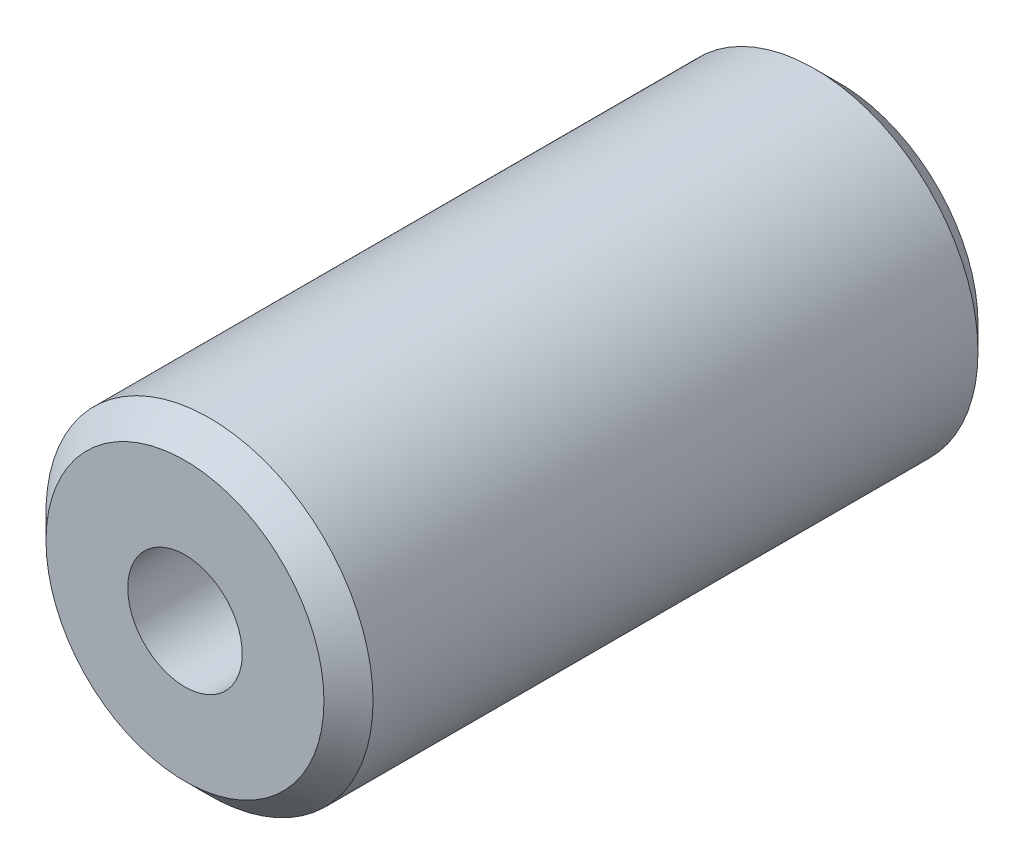
ISO-10303-21;
HEADER;
FILE_DESCRIPTION(('STEP AP214'),'2;1');
FILE_NAME('part.step','',(''),(''),'','','');
FILE_SCHEMA(('AUTOMOTIVE_DESIGN { 1 0 10303 214 1 1 1 1 }'));
ENDSEC;
DATA;
#1=APPLICATION_CONTEXT('core data for automotive mechanical design processes');
#2=APPLICATION_PROTOCOL_DEFINITION('international standard','automotive_design',2000,#1);
#3=PRODUCT_CONTEXT('',#1,'mechanical');
#4=PRODUCT('Part','Part','',(#3));
#5=PRODUCT_RELATED_PRODUCT_CATEGORY('part','',(#4));
#6=PRODUCT_DEFINITION_FORMATION('','',#4);
#7=PRODUCT_DEFINITION_CONTEXT('part definition',#1,'design');
#8=PRODUCT_DEFINITION('design','',#6,#7);
#9=PRODUCT_DEFINITION_SHAPE('','',#8);
#10=(LENGTH_UNIT() NAMED_UNIT(*) SI_UNIT(.MILLI.,.METRE.));
#11=(NAMED_UNIT(*) PLANE_ANGLE_UNIT() SI_UNIT($,.RADIAN.));
#12=(NAMED_UNIT(*) SI_UNIT($,.STERADIAN.) SOLID_ANGLE_UNIT());
#13=UNCERTAINTY_MEASURE_WITH_UNIT(LENGTH_MEASURE(1.E-05),#10,'distance_accuracy_value','');
#14=(GEOMETRIC_REPRESENTATION_CONTEXT(3) GLOBAL_UNCERTAINTY_ASSIGNED_CONTEXT((#13)) GLOBAL_UNIT_ASSIGNED_CONTEXT((#10,
#11,#12)) REPRESENTATION_CONTEXT('',''));
#15=CARTESIAN_POINT('',(0.,0.,0.));
#16=DIRECTION('',(0.,0.,1.));
#17=DIRECTION('',(1.,0.,0.));
#18=AXIS2_PLACEMENT_3D('',#15,#16,#17);
#19=CARTESIAN_POINT('',(0.,0.,40.));
#20=DIRECTION('',(0.,0.,-1.));
#21=DIRECTION('',(-1.,0.,0.));
#22=AXIS2_PLACEMENT_3D('',#19,#20,#21);
#23=CYLINDRICAL_SURFACE('',#22,3.5);
#24=CARTESIAN_POINT('',(0.,-3.5,32.5));
#25=CARTESIAN_POINT('',(0.123728813191223,-3.50000063992499,32.5000004827054));
#26=CARTESIAN_POINT('',(0.247452607509519,-3.4933837716556,32.4907620868087));
#27=CARTESIAN_POINT('',(0.490897056966881,-3.46756729775865,32.4544214069871));
#28=CARTESIAN_POINT('',(0.61061594651881,-3.44836221741437,32.4273113505009));
#29=CARTESIAN_POINT('',(0.842134278979704,-3.39922983630841,32.3569876549631));
#30=CARTESIAN_POINT('',(0.953970069083476,-3.3693562097146,32.3138545858561));
#31=CARTESIAN_POINT('',(1.16823399696302,-3.30119473506673,32.2134238357578));
#32=CARTESIAN_POINT('',(1.27066087203771,-3.26290575998324,32.1561242573817));
#33=CARTESIAN_POINT('',(1.4735973979734,-3.17674762370411,32.0234877338018));
#34=CARTESIAN_POINT('',(1.57311214719791,-3.12832735809472,31.9469943369874));
#35=CARTESIAN_POINT('',(1.75878471370039,-3.02784542835155,31.7810699558849));
#36=CARTESIAN_POINT('',(1.84492211922789,-2.97577837204529,31.6916195954786));
#37=CARTESIAN_POINT('',(2.01766896264091,-2.86208795270916,31.4834268963894));
#38=CARTESIAN_POINT('',(2.10145177248818,-2.80046815480895,31.362322942251));
#39=CARTESIAN_POINT('',(2.24759789691731,-2.68458125505734,31.1046118304847));
#40=CARTESIAN_POINT('',(2.30999535105659,-2.63030251861165,30.9680298502545));
#41=CARTESIAN_POINT('',(2.39420227525009,-2.55341938550326,30.7269408056995));
#42=CARTESIAN_POINT('',(2.42261104159712,-2.52624076170168,30.6262164997981));
#43=CARTESIAN_POINT('',(2.46675383593694,-2.48316150088381,30.4197812335764));
#44=CARTESIAN_POINT('',(2.48251474443333,-2.46723695421588,30.3140813570687));
#45=CARTESIAN_POINT('',(2.50034254973894,-2.44917774353951,30.0996013639044));
#46=CARTESIAN_POINT('',(2.5023204979036,-2.44713265311551,29.9908057812075));
#47=CARTESIAN_POINT('',(2.49216996728832,-2.45746365754183,29.7745348292322));
#48=CARTESIAN_POINT('',(2.48002983581059,-2.46985166511363,29.6670606246193));
#49=CARTESIAN_POINT('',(2.44019893993843,-2.50924006406179,29.4432542762594));
#50=CARTESIAN_POINT('',(2.41071787181293,-2.53790670458072,29.3275472658239));
#51=CARTESIAN_POINT('',(2.33698623060058,-2.60595426548788,29.1042352710489));
#52=CARTESIAN_POINT('',(2.29270292673419,-2.64535889377606,28.9966488951225));
#53=CARTESIAN_POINT('',(2.17519571376577,-2.7433598025775,28.7585440006148));
#54=CARTESIAN_POINT('',(2.09725595934503,-2.80411912140021,28.6312521342945));
#55=CARTESIAN_POINT('',(1.92080796250096,-2.92782316656875,28.3929853846134));
#56=CARTESIAN_POINT('',(1.82227950288261,-2.99076998991497,28.2820267236453));
#57=CARTESIAN_POINT('',(1.60466805722389,-3.11300197414729,28.0770898290715));
#58=CARTESIAN_POINT('',(1.48539228396117,-3.17224499078237,27.9832894993579));
#59=CARTESIAN_POINT('',(1.22853771239818,-3.28024169483456,27.8173552555095));
#60=CARTESIAN_POINT('',(1.09100185946155,-3.32901931213849,27.7451717599272));
#61=CARTESIAN_POINT('',(0.837977937487226,-3.40005921099989,27.6417348098091));
#62=CARTESIAN_POINT('',(0.725838222288053,-3.42591205063844,27.6047356194994));
#63=CARTESIAN_POINT('',(0.495579346511703,-3.46670277833946,27.5467451044777));
#64=CARTESIAN_POINT('',(0.377464597804283,-3.48164859772487,27.5257421472034));
#65=CARTESIAN_POINT('',(0.138134688429566,-3.49933682658195,27.5009131533462));
#66=CARTESIAN_POINT('',(0.016910909629529,-3.50204052258512,27.4971416076008));
#67=CARTESIAN_POINT('',(-0.224436907512662,-3.49488258408794,27.5071669527199));
#68=CARTESIAN_POINT('',(-0.344560827664071,-3.48501961477188,27.5209657098801));
#69=CARTESIAN_POINT('',(-0.574421637419463,-3.45439685890596,27.5642095730714));
#70=CARTESIAN_POINT('',(-0.684380739703779,-3.43417853507596,27.5928780362171));
#71=CARTESIAN_POINT('',(-0.897567876620155,-3.38472449846574,27.6639754785557));
#72=CARTESIAN_POINT('',(-1.00079454106229,-3.35548695698345,27.7064072484338));
#73=CARTESIAN_POINT('',(-1.20788320476993,-3.28693977419553,27.807854882314));
#74=CARTESIAN_POINT('',(-1.31095115376589,-3.2469564625953,27.8680270766985));
#75=CARTESIAN_POINT('',(-1.5059594414495,-3.16124256132459,28.0009906273235));
#76=CARTESIAN_POINT('',(-1.59789105848436,-3.11550752347251,28.073791767055));
#77=CARTESIAN_POINT('',(-1.78551589650356,-3.01253197752163,28.2447675416651));
#78=CARTESIAN_POINT('',(-1.87887834330756,-2.95470727969556,28.3451497459149));
#79=CARTESIAN_POINT('',(-2.04830105316355,-2.83988174609795,28.5601350812065));
#80=CARTESIAN_POINT('',(-2.12435208766381,-2.78288136485279,28.6747457472345));
#81=CARTESIAN_POINT('',(-2.2473442646411,-2.68415113950394,28.8985828988252));
#82=CARTESIAN_POINT('',(-2.29697109549401,-2.64142413683914,29.0058861450973));
#83=CARTESIAN_POINT('',(-2.38125378942134,-2.56570672982984,29.2294007982584));
#84=CARTESIAN_POINT('',(-2.41594132264732,-2.5326957757556,29.3455927394091));
#85=CARTESIAN_POINT('',(-2.4634705571157,-2.48640569092986,29.5626821440547));
#86=CARTESIAN_POINT('',(-2.47917783706206,-2.47059656839565,29.6623973933937));
#87=CARTESIAN_POINT('',(-2.49835466240567,-2.45120901302806,29.8641363726842));
#88=CARTESIAN_POINT('',(-2.50183784984414,-2.44761694614491,29.9661574012901));
#89=CARTESIAN_POINT('',(-2.49632174120909,-2.45324019333315,30.1694917900495));
#90=CARTESIAN_POINT('',(-2.48732159992832,-2.46245637461116,30.270805101819));
#91=CARTESIAN_POINT('',(-2.45749256006836,-2.49221948479094,30.4700140533569));
#92=CARTESIAN_POINT('',(-2.43664536213886,-2.51278394118372,30.5679041566293));
#93=CARTESIAN_POINT('',(-2.37535009925765,-2.570997906227,30.7907070775182));
#94=CARTESIAN_POINT('',(-2.33065409759394,-2.61207539816555,30.9135379866369));
#95=CARTESIAN_POINT('',(-2.22450059032411,-2.70305072969477,31.1481520926754));
#96=CARTESIAN_POINT('',(-2.16301522249272,-2.75296318217848,31.2599165006866));
#97=CARTESIAN_POINT('',(-2.02292450312534,-2.85755496874116,31.4746618909581));
#98=CARTESIAN_POINT('',(-1.94390312666551,-2.9123264130957,31.5773257372321));
#99=CARTESIAN_POINT('',(-1.77067968083222,-3.02079035562719,31.7695944266245));
#100=CARTESIAN_POINT('',(-1.67647239517769,-3.07448247590878,31.8591947622818));
#101=CARTESIAN_POINT('',(-1.45596509730888,-3.1855646755345,32.0380239526068));
#102=CARTESIAN_POINT('',(-1.3269319780441,-3.24201372320469,32.1245621516587));
#103=CARTESIAN_POINT('',(-1.12028117539186,-3.31667944446703,32.2363165140429));
#104=CARTESIAN_POINT('',(-1.04921986546208,-3.33989867907087,32.2705572571761));
#105=CARTESIAN_POINT('',(-0.903173022827915,-3.38231539157859,32.3325028129925));
#106=CARTESIAN_POINT('',(-0.82818902614882,-3.40151442917424,32.3602101609261));
#107=CARTESIAN_POINT('',(-0.631868635659961,-3.44466177853936,32.4220729761585));
#108=CARTESIAN_POINT('',(-0.508104933005473,-3.46524216632152,32.4511405355378));
#109=CARTESIAN_POINT('',(-0.256222780653935,-3.49290436679927,32.4900944489021));
#110=CARTESIAN_POINT('',(-0.128108700082427,-3.49999933742225,32.4999995002073));
#111=CARTESIAN_POINT('',(0.,-3.5,32.5));
#112=B_SPLINE_CURVE_WITH_KNOTS('',3,(#24,#25,#26,#27,#28,#29,#30,#31,#32,#33,#34,#35,#36,#37,
#38,#39,#40,#41,#42,#43,#44,#45,#46,#47,#48,#49,#50,#51,#52,#53,#54,#55,#56,#57,#58,#59,#60,#61,
#62,#63,#64,#65,#66,#67,#68,#69,#70,#71,#72,#73,#74,#75,#76,#77,#78,#79,#80,#81,#82,#83,#84,#85,
#86,#87,#88,#89,#90,#91,#92,#93,#94,#95,#96,#97,#98,#99,#100,#101,#102,#103,#104,#105,#106,#107,
#108,#109,#110,#111),.UNSPECIFIED.,.T.,.F.,(4,2,2,2,2,2,2,2,2,2,2,2,2,2,2,2,2,2,2,2,2,2,2,2,2,2,
2,2,2,2,2,2,2,2,2,2,2,2,2,2,2,2,2,4),(0.,0.370678561722373,0.741518441654504,1.11051829384682,
1.47956759466008,1.88169861959201,2.28443732992832,2.76124402205305,3.23728595581211,
3.56047339006296,3.88297212103197,4.20755019318242,4.53239635392983,4.89878958243802,
5.26599840083145,5.74701313668845,6.22850244615394,6.71473144065691,7.19983650067094,
7.56096516289939,7.92183095866112,8.28383713289181,8.64588176217869,8.99068000299139,
9.33554819977724,9.71174322226926,10.0882309906957,10.5328611675572,10.9777278203748,
11.3535772201857,11.728625878901,12.0338187619671,12.3386709424267,12.6435437644843,
12.9488887880462,13.3576912734812,13.7671763401183,14.1876762226839,14.6083208537776,
15.1009923405612,15.3472912000445,15.5934943266635,15.9776696091468,16.3614698531311),.UNSPECIFIED.);
#113=CARTESIAN_POINT('',(0.,-3.5,32.5));
#114=VERTEX_POINT('',#113);
#115=EDGE_CURVE('E86',#114,#114,#112,.T.);
#116=ORIENTED_EDGE('',*,*,#115,.F.);
#117=EDGE_LOOP('',(#116));
#118=FACE_BOUND('',#117,.T.);
#119=CARTESIAN_POINT('',(0.,0.,40.));
#120=DIRECTION('',(0.,0.,1.));
#121=DIRECTION('',(1.,0.,0.));
#122=AXIS2_PLACEMENT_3D('',#119,#120,#121);
#123=CIRCLE('',#122,3.5);
#124=CARTESIAN_POINT('',(3.5,0.,40.));
#125=VERTEX_POINT('',#124);
#126=EDGE_CURVE('E58',#125,#125,#123,.T.);
#127=ORIENTED_EDGE('',*,*,#126,.T.);
#128=EDGE_LOOP('',(#127));
#129=FACE_BOUND('',#128,.T.);
#130=CARTESIAN_POINT('',(0.,0.,25.));
#131=DIRECTION('',(0.,0.,-1.));
#132=DIRECTION('',(-1.,0.,0.));
#133=AXIS2_PLACEMENT_3D('',#130,#131,#132);
#134=CIRCLE('',#133,3.5);
#135=CARTESIAN_POINT('',(-3.5,0.,25.));
#136=VERTEX_POINT('',#135);
#137=EDGE_CURVE('E56',#136,#136,#134,.T.);
#138=ORIENTED_EDGE('',*,*,#137,.T.);
#139=EDGE_LOOP('',(#138));
#140=FACE_BOUND('',#139,.T.);
#141=ADVANCED_FACE('F33',(#118,#129,#140),#23,.F.);
#142=CARTESIAN_POINT('',(0.,0.,40.));
#143=DIRECTION('',(0.,0.,1.));
#144=DIRECTION('',(1.,0.,0.));
#145=AXIS2_PLACEMENT_3D('',#142,#143,#144);
#146=PLANE('',#145);
#147=CARTESIAN_POINT('',(0.,0.,40.));
#148=DIRECTION('',(0.,0.,1.));
#149=DIRECTION('',(1.,0.,0.));
#150=AXIS2_PLACEMENT_3D('',#147,#148,#149);
#151=CIRCLE('',#150,8.49999999999999);
#152=CARTESIAN_POINT('',(8.49999999999999,0.,40.));
#153=VERTEX_POINT('',#152);
#154=EDGE_CURVE('E137',#153,#153,#151,.T.);
#155=ORIENTED_EDGE('',*,*,#154,.T.);
#156=EDGE_LOOP('',(#155));
#157=FACE_BOUND('',#156,.T.);
#158=ORIENTED_EDGE('',*,*,#126,.F.);
#159=EDGE_LOOP('',(#158));
#160=FACE_BOUND('',#159,.T.);
#161=ADVANCED_FACE('F112',(#157,#160),#146,.T.);
#162=CARTESIAN_POINT('',(0.,0.,0.));
#163=DIRECTION('',(0.,0.,1.));
#164=DIRECTION('',(1.,0.,0.));
#165=AXIS2_PLACEMENT_3D('',#162,#163,#164);
#166=PLANE('',#165);
#167=CARTESIAN_POINT('',(0.,0.,0.));
#168=DIRECTION('',(0.,0.,-1.));
#169=DIRECTION('',(-1.,0.,0.));
#170=AXIS2_PLACEMENT_3D('',#167,#168,#169);
#171=CIRCLE('',#170,6.);
#172=CARTESIAN_POINT('',(-6.,0.,0.));
#173=VERTEX_POINT('',#172);
#174=EDGE_CURVE('E132',#173,#173,#171,.T.);
#175=ORIENTED_EDGE('',*,*,#174,.F.);
#176=EDGE_LOOP('',(#175));
#177=FACE_BOUND('',#176,.T.);
#178=CARTESIAN_POINT('',(0.,0.,0.));
#179=DIRECTION('',(0.,0.,1.));
#180=DIRECTION('',(1.,0.,0.));
#181=AXIS2_PLACEMENT_3D('',#178,#179,#180);
#182=CIRCLE('',#181,8.5);
#183=CARTESIAN_POINT('',(8.5,0.,0.));
#184=VERTEX_POINT('',#183);
#185=EDGE_CURVE('E10',#184,#184,#182,.F.);
#186=ORIENTED_EDGE('',*,*,#185,.T.);
#187=EDGE_LOOP('',(#186));
#188=FACE_BOUND('',#187,.T.);
#189=ADVANCED_FACE('F96',(#177,#188),#166,.F.);
#190=CARTESIAN_POINT('',(0.,0.,40.));
#191=DIRECTION('',(0.,0.,-1.));
#192=DIRECTION('',(-1.,0.,0.));
#193=AXIS2_PLACEMENT_3D('',#190,#191,#192);
#194=CYLINDRICAL_SURFACE('',#193,10.);
#195=CARTESIAN_POINT('',(0.,-10.,12.5));
#196=CARTESIAN_POINT('',(0.138126814449552,-9.99999766446687,12.4999961237697));
#197=CARTESIAN_POINT('',(0.276296929717939,-9.99710963553044,12.4885140820437));
#198=CARTESIAN_POINT('',(0.548677206284221,-9.98586856383157,12.442958081155));
#199=CARTESIAN_POINT('',(0.682885078117899,-9.97751242366627,12.4088713174369));
#200=CARTESIAN_POINT('',(0.943368120304295,-9.9562604388672,12.3192679108965));
#201=CARTESIAN_POINT('',(1.06965260571667,-9.94337004736764,12.2637770021412));
#202=CARTESIAN_POINT('',(1.31112021984071,-9.91442239679369,12.1330310165919));
#203=CARTESIAN_POINT('',(1.42630297391461,-9.89836503090261,12.0577752731351));
#204=CARTESIAN_POINT('',(1.64466987883486,-9.86445689319489,11.8879986839097));
#205=CARTESIAN_POINT('',(1.74759281676843,-9.84657845246877,11.7931473750682));
#206=CARTESIAN_POINT('',(1.93624821200553,-9.8112270019656,11.5875796584849));
#207=CARTESIAN_POINT('',(2.02197872824865,-9.79375403816446,11.4768614617551));
#208=CARTESIAN_POINT('',(2.17504423799829,-9.76091292830281,11.240674622105));
#209=CARTESIAN_POINT('',(2.2420870265419,-9.74557990774685,11.1150112819855));
#210=CARTESIAN_POINT('',(2.35399484758457,-9.71915824696694,10.8537526472333));
#211=CARTESIAN_POINT('',(2.39886342573357,-9.70806892824031,10.7181589444466));
#212=CARTESIAN_POINT('',(2.46425806134127,-9.69167461160538,10.4437608363306));
#213=CARTESIAN_POINT('',(2.48525378055342,-9.68625818328352,10.30507517327));
#214=CARTESIAN_POINT('',(2.50376962511068,-9.68148937432652,10.0260523850011));
#215=CARTESIAN_POINT('',(2.50129356969685,-9.68213600713214,9.88571553217977));
#216=CARTESIAN_POINT('',(2.47331087439951,-9.68932009194695,9.61097365375775));
#217=CARTESIAN_POINT('',(2.44836390031772,-9.69571438345489,9.47650729755778));
#218=CARTESIAN_POINT('',(2.37704031150499,-9.71344516118448,9.2137315818149));
#219=CARTESIAN_POINT('',(2.33066217011566,-9.72478199948731,9.08542266161846));
#220=CARTESIAN_POINT('',(2.21731579656197,-9.75125189842765,8.83710330624645));
#221=CARTESIAN_POINT('',(2.1501444453882,-9.76642212449693,8.71718971368405));
#222=CARTESIAN_POINT('',(1.99726046002491,-9.79882851409985,8.49013548373863));
#223=CARTESIAN_POINT('',(1.91154458134806,-9.81606503891047,8.38299708655458));
#224=CARTESIAN_POINT('',(1.72110570780203,-9.85126467566485,8.18132730717599));
#225=CARTESIAN_POINT('',(1.61591043027643,-9.86923449130001,8.08724251656442));
#226=CARTESIAN_POINT('',(1.39101986250617,-9.90343275964594,7.9179645958935));
#227=CARTESIAN_POINT('',(1.27132412951324,-9.91966115915679,7.84277204289406));
#228=CARTESIAN_POINT('',(1.02019314780232,-9.94862886823651,7.71324902295936));
#229=CARTESIAN_POINT('',(0.88871898868104,-9.96135600212879,7.65899109957595));
#230=CARTESIAN_POINT('',(0.618126680238138,-9.98179861652361,7.57347115715071));
#231=CARTESIAN_POINT('',(0.479009998584141,-9.98951505565468,7.5422047393031));
#232=CARTESIAN_POINT('',(0.200899950650045,-9.99892498785624,7.50423739073527));
#233=CARTESIAN_POINT('',(0.0619945333136832,-10.0007675584713,7.49692828987449));
#234=CARTESIAN_POINT('',(-0.215054791335847,-9.99864674690754,7.50541500342581));
#235=CARTESIAN_POINT('',(-0.353198766074327,-9.99468388736421,7.52120873799856));
#236=CARTESIAN_POINT('',(-0.622690447960818,-9.98149301878918,7.57495151398563));
#237=CARTESIAN_POINT('',(-0.754108531614584,-9.97234390309647,7.61256877246162));
#238=CARTESIAN_POINT('',(-1.00876215408753,-9.94981177723595,7.7085118067141));
#239=CARTESIAN_POINT('',(-1.13199686505442,-9.93642833949965,7.76683967385537));
#240=CARTESIAN_POINT('',(-1.36920522404972,-9.9065551321037,7.90372688145779));
#241=CARTESIAN_POINT('',(-1.48297573639294,-9.89001445610999,7.98262685399427));
#242=CARTESIAN_POINT('',(-1.69587768940552,-9.85574181979586,8.15798318132861));
#243=CARTESIAN_POINT('',(-1.79500659828875,-9.83800965421578,8.25444256602941));
#244=CARTESIAN_POINT('',(-1.97831761345414,-9.80281594932498,8.46500326807284));
#245=CARTESIAN_POINT('',(-2.06207311270184,-9.78537173637463,8.57947950499927));
#246=CARTESIAN_POINT('',(-2.20918459835604,-9.75321463970069,8.82122105744763));
#247=CARTESIAN_POINT('',(-2.27254149026901,-9.73850163474941,8.94848580495074));
#248=CARTESIAN_POINT('',(-2.37658570101223,-9.71363491194665,9.21150953734373));
#249=CARTESIAN_POINT('',(-2.41740732773931,-9.70345425375809,9.34721271385383));
#250=CARTESIAN_POINT('',(-2.47557609990489,-9.68877906706585,9.62384939642549));
#251=CARTESIAN_POINT('',(-2.49292837912652,-9.68428329504044,9.76478175170242));
#252=CARTESIAN_POINT('',(-2.50339765056083,-9.68158168701612,10.0435350397693));
#253=CARTESIAN_POINT('',(-2.49719649630132,-9.68319887888035,10.1813290585441));
#254=CARTESIAN_POINT('',(-2.46229546385366,-9.69213181672143,10.4538398144438));
#255=CARTESIAN_POINT('',(-2.43359603781098,-9.69944744817732,10.5885566133553));
#256=CARTESIAN_POINT('',(-2.35488553240495,-9.71885434473222,10.8503474317764));
#257=CARTESIAN_POINT('',(-2.30500234113404,-9.73091692061057,10.9774621754006));
#258=CARTESIAN_POINT('',(-2.18544152267504,-9.7584625954084,11.2216089711893));
#259=CARTESIAN_POINT('',(-2.11576115005696,-9.77394616867808,11.3386396219781));
#260=CARTESIAN_POINT('',(-1.95644624772858,-9.80709390439337,11.5625910483368));
#261=CARTESIAN_POINT('',(-1.86633860485376,-9.82480441386302,11.6691684557066));
#262=CARTESIAN_POINT('',(-1.66964895198289,-9.86013378743769,11.8659117413257));
#263=CARTESIAN_POINT('',(-1.56306303543524,-9.87775262878422,11.9560737168549));
#264=CARTESIAN_POINT('',(-1.33411264450432,-9.91129426079449,12.1190188476077));
#265=CARTESIAN_POINT('',(-1.21149737052731,-9.92718055609783,12.1914576894526));
#266=CARTESIAN_POINT('',(-0.95544343251746,-9.95508208291861,12.3145791049009));
#267=CARTESIAN_POINT('',(-0.8220126057279,-9.96710008666301,12.3652772677476));
#268=CARTESIAN_POINT('',(-0.57401708873912,-9.98413432609236,12.4359530505494));
#269=CARTESIAN_POINT('',(-0.460633618180115,-9.99004308421151,12.4599187384224));
#270=CARTESIAN_POINT('',(-0.231510119227139,-9.9979767538658,12.4919432393699));
#271=CARTESIAN_POINT('',(-0.115770268737694,-10.0000019575149,12.5000032488422));
#272=CARTESIAN_POINT('',(0.,-10.,12.5));
#273=B_SPLINE_CURVE_WITH_KNOTS('',3,(#195,#196,#197,#198,#199,#200,#201,#202,#203,#204,#205,
#206,#207,#208,#209,#210,#211,#212,#213,#214,#215,#216,#217,#218,#219,#220,#221,#222,#223,#224,
#225,#226,#227,#228,#229,#230,#231,#232,#233,#234,#235,#236,#237,#238,#239,#240,#241,#242,#243,
#244,#245,#246,#247,#248,#249,#250,#251,#252,#253,#254,#255,#256,#257,#258,#259,#260,#261,#262,
#263,#264,#265,#266,#267,#268,#269,#270,#271,#272),.UNSPECIFIED.,.T.,.F.,(4,2,2,2,2,2,2,2,2,2,2,
2,2,2,2,2,2,2,2,2,2,2,2,2,2,2,2,2,2,2,2,2,2,2,2,2,2,2,4),(0.,0.41395618745315,0.828147062939833,
1.24184150381018,1.65554990028221,2.07690725728565,2.4983121596677,2.92597745909678,
3.35357435282281,3.77260491835116,4.19156730193363,4.60037495017231,5.00921172448932,
5.42217546462,5.83521151399139,6.26002501620567,6.6848514926928,7.11113715020725,
7.53734122819939,7.95263848254328,8.36789835193439,8.7770045752893,9.18615212209352,
9.60255979281122,10.0190393835223,10.4457418201299,10.8724253125471,11.2965375769764,
11.7205570543048,12.1323963400748,12.5442273493652,12.9536066760888,13.3630428023797,
13.7831596069298,14.2033761629383,14.6312030917578,15.0587227304538,15.4057040491338,
15.752659267482),.UNSPECIFIED.);
#274=CARTESIAN_POINT('',(0.,-10.,12.5));
#275=VERTEX_POINT('',#274);
#276=EDGE_CURVE('E67',#275,#275,#273,.T.);
#277=ORIENTED_EDGE('',*,*,#276,.T.);
#278=EDGE_LOOP('',(#277));
#279=FACE_BOUND('',#278,.T.);
#280=CARTESIAN_POINT('',(0.,-10.,32.5));
#281=CARTESIAN_POINT('',(0.138126814449552,-9.99999766446687,32.4999961237697));
#282=CARTESIAN_POINT('',(0.276296929717938,-9.99710963553044,32.4885140820437));
#283=CARTESIAN_POINT('',(0.548677206284221,-9.98586856383157,32.442958081155));
#284=CARTESIAN_POINT('',(0.682885078117899,-9.97751242366627,32.4088713174369));
#285=CARTESIAN_POINT('',(0.943368120304296,-9.9562604388672,32.3192679108965));
#286=CARTESIAN_POINT('',(1.06965260571667,-9.94337004736764,32.2637770021412));
#287=CARTESIAN_POINT('',(1.31112021984072,-9.91442239679369,32.1330310165919));
#288=CARTESIAN_POINT('',(1.42630297391461,-9.89836503090261,32.0577752731351));
#289=CARTESIAN_POINT('',(1.64466987883486,-9.86445689319489,31.8879986839097));
#290=CARTESIAN_POINT('',(1.74759281676843,-9.84657845246877,31.7931473750682));
#291=CARTESIAN_POINT('',(1.93624821200553,-9.8112270019656,31.5875796584849));
#292=CARTESIAN_POINT('',(2.02197872824865,-9.79375403816446,31.4768614617551));
#293=CARTESIAN_POINT('',(2.17504423799829,-9.76091292830281,31.240674622105));
#294=CARTESIAN_POINT('',(2.2420870265419,-9.74557990774685,31.1150112819854));
#295=CARTESIAN_POINT('',(2.35399484758457,-9.71915824696694,30.8537526472333));
#296=CARTESIAN_POINT('',(2.39886342573357,-9.70806892824031,30.7181589444466));
#297=CARTESIAN_POINT('',(2.46425806134128,-9.69167461160538,30.4437608363306));
#298=CARTESIAN_POINT('',(2.48525378055342,-9.68625818328352,30.30507517327));
#299=CARTESIAN_POINT('',(2.50376962511068,-9.68148937432652,30.0260523850011));
#300=CARTESIAN_POINT('',(2.50129356969685,-9.68213600713214,29.8857155321798));
#301=CARTESIAN_POINT('',(2.47331087439951,-9.68932009194695,29.6109736537577));
#302=CARTESIAN_POINT('',(2.44836390031772,-9.69571438345489,29.4765072975578));
#303=CARTESIAN_POINT('',(2.37704031150499,-9.71344516118448,29.2137315818149));
#304=CARTESIAN_POINT('',(2.33066217011566,-9.72478199948731,29.0854226616185));
#305=CARTESIAN_POINT('',(2.21731579656198,-9.75125189842765,28.8371033062464));
#306=CARTESIAN_POINT('',(2.1501444453882,-9.76642212449693,28.717189713684));
#307=CARTESIAN_POINT('',(1.99726046002491,-9.79882851409985,28.4901354837386));
#308=CARTESIAN_POINT('',(1.91154458134806,-9.81606503891047,28.3829970865546));
#309=CARTESIAN_POINT('',(1.72110570780204,-9.85126467566485,28.181327307176));
#310=CARTESIAN_POINT('',(1.61591043027643,-9.86923449130002,28.0872425165644));
#311=CARTESIAN_POINT('',(1.39101986250617,-9.90343275964593,27.9179645958935));
#312=CARTESIAN_POINT('',(1.27132412951324,-9.91966115915679,27.8427720428941));
#313=CARTESIAN_POINT('',(1.02019314780232,-9.94862886823651,27.7132490229594));
#314=CARTESIAN_POINT('',(0.888718988681039,-9.96135600212879,27.6589910995759));
#315=CARTESIAN_POINT('',(0.618126680238137,-9.98179861652361,27.5734711571507));
#316=CARTESIAN_POINT('',(0.47900999858414,-9.98951505565468,27.5422047393031));
#317=CARTESIAN_POINT('',(0.200899950650044,-9.99892498785624,27.5042373907353));
#318=CARTESIAN_POINT('',(0.0619945333136828,-10.0007675584713,27.4969282898745));
#319=CARTESIAN_POINT('',(-0.215054791335848,-9.99864674690754,27.5054150034258));
#320=CARTESIAN_POINT('',(-0.353198766074327,-9.99468388736421,27.5212087379986));
#321=CARTESIAN_POINT('',(-0.622690447960818,-9.98149301878918,27.5749515139856));
#322=CARTESIAN_POINT('',(-0.754108531614584,-9.97234390309647,27.6125687724616));
#323=CARTESIAN_POINT('',(-1.00876215408753,-9.94981177723595,27.7085118067141));
#324=CARTESIAN_POINT('',(-1.13199686505442,-9.93642833949965,27.7668396738554));
#325=CARTESIAN_POINT('',(-1.36920522404972,-9.9065551321037,27.9037268814578));
#326=CARTESIAN_POINT('',(-1.48297573639295,-9.89001445610999,27.9826268539943));
#327=CARTESIAN_POINT('',(-1.69587768940552,-9.85574181979586,28.1579831813286));
#328=CARTESIAN_POINT('',(-1.79500659828875,-9.83800965421578,28.2544425660294));
#329=CARTESIAN_POINT('',(-1.97831761345414,-9.80281594932498,28.4650032680728));
#330=CARTESIAN_POINT('',(-2.06207311270184,-9.78537173637463,28.5794795049993));
#331=CARTESIAN_POINT('',(-2.20918459835605,-9.75321463970069,28.8212210574476));
#332=CARTESIAN_POINT('',(-2.27254149026901,-9.73850163474941,28.9484858049507));
#333=CARTESIAN_POINT('',(-2.37658570101223,-9.71363491194665,29.2115095373437));
#334=CARTESIAN_POINT('',(-2.41740732773931,-9.70345425375809,29.3472127138538));
#335=CARTESIAN_POINT('',(-2.47557609990489,-9.68877906706585,29.6238493964255));
#336=CARTESIAN_POINT('',(-2.49292837912652,-9.68428329504044,29.7647817517024));
#337=CARTESIAN_POINT('',(-2.50339765056083,-9.68158168701612,30.0435350397693));
#338=CARTESIAN_POINT('',(-2.49719649630132,-9.68319887888034,30.1813290585441));
#339=CARTESIAN_POINT('',(-2.46229546385366,-9.69213181672143,30.4538398144438));
#340=CARTESIAN_POINT('',(-2.43359603781098,-9.69944744817732,30.5885566133553));
#341=CARTESIAN_POINT('',(-2.35488553240496,-9.71885434473222,30.8503474317764));
#342=CARTESIAN_POINT('',(-2.30500234113404,-9.73091692061057,30.9774621754006));
#343=CARTESIAN_POINT('',(-2.18544152267504,-9.7584625954084,31.2216089711893));
#344=CARTESIAN_POINT('',(-2.11576115005696,-9.77394616867808,31.3386396219781));
#345=CARTESIAN_POINT('',(-1.95644624772859,-9.80709390439338,31.5625910483368));
#346=CARTESIAN_POINT('',(-1.86633860485376,-9.82480441386302,31.6691684557066));
#347=CARTESIAN_POINT('',(-1.66964895198289,-9.86013378743769,31.8659117413257));
#348=CARTESIAN_POINT('',(-1.56306303543524,-9.87775262878422,31.9560737168549));
#349=CARTESIAN_POINT('',(-1.33411264450432,-9.9112942607945,32.1190188476077));
#350=CARTESIAN_POINT('',(-1.21149737052731,-9.92718055609783,32.1914576894526));
#351=CARTESIAN_POINT('',(-0.955443432517462,-9.95508208291861,32.3145791049009));
#352=CARTESIAN_POINT('',(-0.8220126057279,-9.96710008666302,32.3652772677476));
#353=CARTESIAN_POINT('',(-0.57401708873912,-9.98413432609236,32.4359530505494));
#354=CARTESIAN_POINT('',(-0.460633618180115,-9.99004308421151,32.4599187384224));
#355=CARTESIAN_POINT('',(-0.231510119227139,-9.9979767538658,32.4919432393699));
#356=CARTESIAN_POINT('',(-0.115770268737694,-10.0000019575149,32.5000032488422));
#357=CARTESIAN_POINT('',(0.,-10.,32.5));
#358=B_SPLINE_CURVE_WITH_KNOTS('',3,(#280,#281,#282,#283,#284,#285,#286,#287,#288,#289,#290,
#291,#292,#293,#294,#295,#296,#297,#298,#299,#300,#301,#302,#303,#304,#305,#306,#307,#308,#309,
#310,#311,#312,#313,#314,#315,#316,#317,#318,#319,#320,#321,#322,#323,#324,#325,#326,#327,#328,
#329,#330,#331,#332,#333,#334,#335,#336,#337,#338,#339,#340,#341,#342,#343,#344,#345,#346,#347,
#348,#349,#350,#351,#352,#353,#354,#355,#356,#357),.UNSPECIFIED.,.T.,.F.,(4,2,2,2,2,2,2,2,2,2,2,
2,2,2,2,2,2,2,2,2,2,2,2,2,2,2,2,2,2,2,2,2,2,2,2,2,2,2,4),(0.,0.413956187453149,
0.828147062939833,1.24184150381018,1.65554990028221,2.07690725728565,2.4983121596677,
2.92597745909679,3.35357435282281,3.77260491835117,4.19156730193363,4.60037495017232,
5.00921172448932,5.42217546462,5.83521151399139,6.26002501620567,6.6848514926928,
7.11113715020725,7.5373412281994,7.95263848254329,8.36789835193439,8.77700457528931,
9.18615212209353,9.60255979281122,10.0190393835223,10.44574182013,10.8724253125471,
11.2965375769764,11.7205570543048,12.1323963400749,12.5442273493652,12.9536066760888,
13.3630428023797,13.7831596069298,14.2033761629383,14.6312030917578,15.0587227304538,
15.4057040491338,15.752659267482),.UNSPECIFIED.);
#359=CARTESIAN_POINT('',(0.,-10.,32.5));
#360=VERTEX_POINT('',#359);
#361=EDGE_CURVE('E38',#360,#360,#358,.T.);
#362=ORIENTED_EDGE('',*,*,#361,.T.);
#363=EDGE_LOOP('',(#362));
#364=FACE_BOUND('',#363,.T.);
#365=CARTESIAN_POINT('',(0.,0.,38.5));
#366=DIRECTION('',(0.,0.,1.));
#367=DIRECTION('',(1.,0.,0.));
#368=AXIS2_PLACEMENT_3D('',#365,#366,#367);
#369=CIRCLE('',#368,10.);
#370=CARTESIAN_POINT('',(10.,0.,38.5));
#371=VERTEX_POINT('',#370);
#372=EDGE_CURVE('E47',#371,#371,#369,.F.);
#373=ORIENTED_EDGE('',*,*,#372,.T.);
#374=EDGE_LOOP('',(#373));
#375=FACE_BOUND('',#374,.T.);
#376=CARTESIAN_POINT('',(0.,0.,1.49999999999999));
#377=DIRECTION('',(0.,0.,1.));
#378=DIRECTION('',(1.,0.,0.));
#379=AXIS2_PLACEMENT_3D('',#376,#377,#378);
#380=CIRCLE('',#379,10.);
#381=CARTESIAN_POINT('',(10.,0.,1.49999999999999));
#382=VERTEX_POINT('',#381);
#383=EDGE_CURVE('E52',#382,#382,#380,.T.);
#384=ORIENTED_EDGE('',*,*,#383,.T.);
#385=EDGE_LOOP('',(#384));
#386=FACE_BOUND('',#385,.T.);
#387=ADVANCED_FACE('F91',(#279,#364,#375,#386),#194,.T.);
#388=CARTESIAN_POINT('',(0.,0.,40.));
#389=DIRECTION('',(0.,0.,-1.));
#390=DIRECTION('',(-1.,0.,0.));
#391=AXIS2_PLACEMENT_3D('',#388,#389,#390);
#392=CONICAL_SURFACE('',#391,8.49999999999999,0.785398163397448);
#393=ORIENTED_EDGE('',*,*,#372,.F.);
#394=EDGE_LOOP('',(#393));
#395=FACE_BOUND('',#394,.T.);
#396=ORIENTED_EDGE('',*,*,#154,.F.);
#397=EDGE_LOOP('',(#396));
#398=FACE_BOUND('',#397,.T.);
#399=ADVANCED_FACE('F95',(#395,#398),#392,.T.);
#400=CARTESIAN_POINT('',(0.,0.,1.49999999999999));
#401=DIRECTION('',(0.,0.,1.));
#402=DIRECTION('',(1.,0.,0.));
#403=AXIS2_PLACEMENT_3D('',#400,#401,#402);
#404=CONICAL_SURFACE('',#403,10.,0.785398163397451);
#405=ORIENTED_EDGE('',*,*,#185,.F.);
#406=EDGE_LOOP('',(#405));
#407=FACE_BOUND('',#406,.T.);
#408=ORIENTED_EDGE('',*,*,#383,.F.);
#409=EDGE_LOOP('',(#408));
#410=FACE_BOUND('',#409,.T.);
#411=ADVANCED_FACE('F36',(#407,#410),#404,.T.);
#412=CARTESIAN_POINT('',(0.,0.,25.));
#413=DIRECTION('',(0.,0.,-1.));
#414=DIRECTION('',(-1.,0.,0.));
#415=AXIS2_PLACEMENT_3D('',#412,#413,#414);
#416=CYLINDRICAL_SURFACE('',#415,6.);
#417=CARTESIAN_POINT('',(0.,-6.,12.5));
#418=CARTESIAN_POINT('',(-0.133903918163791,-5.99999628290907,12.4999952878604));
#419=CARTESIAN_POINT('',(-0.268039524991424,-5.99546656821164,12.4891786843995));
#420=CARTESIAN_POINT('',(-0.532498019991113,-5.97780115788617,12.4463192619064));
#421=CARTESIAN_POINT('',(-0.662810029808669,-5.96464300599791,12.4142210532185));
#422=CARTESIAN_POINT('',(-0.915376593299225,-5.93112629106012,12.3301785119407));
#423=CARTESIAN_POINT('',(-1.03765681434384,-5.91079213642029,12.2783014076769));
#424=CARTESIAN_POINT('',(-1.27165974779733,-5.8649055925345,12.1564541669781));
#425=CARTESIAN_POINT('',(-1.38338564416287,-5.83935478441347,12.0864895110252));
#426=CARTESIAN_POINT('',(-1.59889674004597,-5.78415660619864,11.9267420881925));
#427=CARTESIAN_POINT('',(-1.70208251703042,-5.75437507703433,11.8361973967483));
#428=CARTESIAN_POINT('',(-1.8923196601971,-5.69465427085229,11.6394713160995));
#429=CARTESIAN_POINT('',(-1.9793625312399,-5.66471491925558,11.5332817462849));
#430=CARTESIAN_POINT('',(-2.13907474876483,-5.60642043928224,11.3019464489895));
#431=CARTESIAN_POINT('',(-2.2108261616941,-5.57821573827599,11.1761251042486));
#432=CARTESIAN_POINT('',(-2.331878813161,-5.52871144633222,10.9128534830571));
#433=CARTESIAN_POINT('',(-2.38119161708799,-5.50740829980501,10.7754092407429));
#434=CARTESIAN_POINT('',(-2.45349196589845,-5.47557110795537,10.4996926167385));
#435=CARTESIAN_POINT('',(-2.47763315746001,-5.46456775308951,10.361779033289));
#436=CARTESIAN_POINT('',(-2.50250419944798,-5.45322652433633,10.0834534145536));
#437=CARTESIAN_POINT('',(-2.5032469611117,-5.45288276849133,9.94304279992962));
#438=CARTESIAN_POINT('',(-2.48216900725155,-5.46250239122986,9.67519987914758));
#439=CARTESIAN_POINT('',(-2.46207362224014,-5.47167765447589,9.54759780687576));
#440=CARTESIAN_POINT('',(-2.40278382032142,-5.49796965547249,9.29777581799454));
#441=CARTESIAN_POINT('',(-2.36358574574513,-5.51508791407034,9.17555693701519));
#442=CARTESIAN_POINT('',(-2.2664391745498,-5.55572369545608,8.93688459401841));
#443=CARTESIAN_POINT('',(-2.20810943078429,-5.57936963898298,8.82060915817359));
#444=CARTESIAN_POINT('',(-2.07462485161169,-5.63036662282146,8.59904453223936));
#445=CARTESIAN_POINT('',(-1.99946338103921,-5.65771912259552,8.49375969877287));
#446=CARTESIAN_POINT('',(-1.82699193108754,-5.71585953755966,8.28780008253443));
#447=CARTESIAN_POINT('',(-1.72834696641502,-5.74674242808947,8.18826686522916));
#448=CARTESIAN_POINT('',(-1.51545918210306,-5.80651346225056,8.00677299408161));
#449=CARTESIAN_POINT('',(-1.40121271889693,-5.83540113754019,7.92481645661564));
#450=CARTESIAN_POINT('',(-1.15689589738675,-5.88876567112946,7.77912835276747));
#451=CARTESIAN_POINT('',(-1.02652116489536,-5.91312533086667,7.71586110969864));
#452=CARTESIAN_POINT('',(-0.75570480505367,-5.95378962829607,7.61255772079348));
#453=CARTESIAN_POINT('',(-0.615268789590074,-5.970098716916,7.57250873611237));
#454=CARTESIAN_POINT('',(-0.337856226692458,-5.9919928237277,7.51916801574673));
#455=CARTESIAN_POINT('',(-0.201222570557281,-5.9981908209425,7.5043442851125));
#456=CARTESIAN_POINT('',(0.072709310992175,-6.00112100737489,7.49730755277181));
#457=CARTESIAN_POINT('',(0.210007334305268,-5.99785591423878,7.505088059496));
#458=CARTESIAN_POINT('',(0.474196484682869,-5.9826243531388,7.54194216961213));
#459=CARTESIAN_POINT('',(0.601265933278773,-5.97109774567979,7.56993990819439));
#460=CARTESIAN_POINT('',(0.848765497942177,-5.94097213544829,7.64493638908157));
#461=CARTESIAN_POINT('',(0.969194773036711,-5.92237223919408,7.69193753190061));
#462=CARTESIAN_POINT('',(1.20421799973828,-5.87916541290331,7.80514195142422));
#463=CARTESIAN_POINT('',(1.31851447371068,-5.85438982938561,7.87189636629204));
#464=CARTESIAN_POINT('',(1.53469243246282,-5.80147609158182,8.02210675558341));
#465=CARTESIAN_POINT('',(1.63656870520375,-5.77333653537473,8.10556970305865));
#466=CARTESIAN_POINT('',(1.83266686054867,-5.71424175790867,8.29380646654471));
#467=CARTESIAN_POINT('',(1.92582139596023,-5.68322903182028,8.39967700597211));
#468=CARTESIAN_POINT('',(2.09333969221046,-5.6236867353604,8.6260425518712));
#469=CARTESIAN_POINT('',(2.16769918571027,-5.59515772986987,8.74654087034502));
#470=CARTESIAN_POINT('',(2.2963192041761,-5.54362772487864,9.00122835060358));
#471=CARTESIAN_POINT('',(2.35027836475451,-5.52071125109802,9.13558807102374));
#472=CARTESIAN_POINT('',(2.43434827902353,-5.48416711318335,9.41274118762612));
#473=CARTESIAN_POINT('',(2.46447869724417,-5.47053179113073,9.55552752498876));
#474=CARTESIAN_POINT('',(2.49808160700532,-5.4552632907308,9.83363739837806));
#475=CARTESIAN_POINT('',(2.50342760836084,-5.45278701929113,9.96868932451195));
#476=CARTESIAN_POINT('',(2.49231151038001,-5.45787706027259,10.2376857223555));
#477=CARTESIAN_POINT('',(2.47585275892879,-5.46544183100007,10.3716303609001));
#478=CARTESIAN_POINT('',(2.42316809595844,-5.48899102586044,10.6281854946778));
#479=CARTESIAN_POINT('',(2.38789807270203,-5.50456709625453,10.7510333459775));
#480=CARTESIAN_POINT('',(2.29952656276963,-5.54206362465904,10.989096043664));
#481=CARTESIAN_POINT('',(2.24642006560089,-5.56398586515028,11.104308734336));
#482=CARTESIAN_POINT('',(2.1202057237392,-5.61333908853254,11.331391788147));
#483=CARTESIAN_POINT('',(2.04608723750136,-5.64102204404079,11.4426446459478));
#484=CARTESIAN_POINT('',(1.88136812596239,-5.69807379131314,11.6517202931151));
#485=CARTESIAN_POINT('',(1.79076178563716,-5.72744316520044,11.7495384050324));
#486=CARTESIAN_POINT('',(1.58780416898838,-5.78712781593092,11.9362973056175));
#487=CARTESIAN_POINT('',(1.47434977868814,-5.8173561917501,12.0240726428278));
#488=CARTESIAN_POINT('',(1.23319985958043,-5.87320303099821,12.1793991300421));
#489=CARTESIAN_POINT('',(1.1054978774169,-5.89881939160172,12.2469410639968));
#490=CARTESIAN_POINT('',(0.841465213422195,-5.94218308378896,12.3584188704516));
#491=CARTESIAN_POINT('',(0.705312056415868,-5.96005349044659,12.4027264942901));
#492=CARTESIAN_POINT('',(0.42681678207027,-5.9864223497589,12.4674156875296));
#493=CARTESIAN_POINT('',(0.284495506121991,-5.99495014042422,12.4878721682058));
#494=CARTESIAN_POINT('',(0.118052512349439,-5.99888566614292,12.4973238417862));
#495=CARTESIAN_POINT('',(0.0944569348794044,-5.99930292614998,12.498326602503));
#496=CARTESIAN_POINT('',(0.0472433090693372,-5.99986042138656,12.4996650982568));
#497=CARTESIAN_POINT('',(0.023625260665151,-6.0000006558228,12.5000008313836));
#498=CARTESIAN_POINT('',(0.,-6.,12.5));
#499=B_SPLINE_CURVE_WITH_KNOTS('',3,(#417,#418,#419,#420,#421,#422,#423,#424,#425,#426,#427,
#428,#429,#430,#431,#432,#433,#434,#435,#436,#437,#438,#439,#440,#441,#442,#443,#444,#445,#446,
#447,#448,#449,#450,#451,#452,#453,#454,#455,#456,#457,#458,#459,#460,#461,#462,#463,#464,#465,
#466,#467,#468,#469,#470,#471,#472,#473,#474,#475,#476,#477,#478,#479,#480,#481,#482,#483,#484,
#485,#486,#487,#488,#489,#490,#491,#492,#493,#494,#495,#496,#497,#498),.UNSPECIFIED.,.T.,.F.,(4,
2,2,2,2,2,2,2,2,2,2,2,2,2,2,2,2,2,2,2,2,2,2,2,2,2,2,2,2,2,2,2,2,2,2,2,2,2,2,2,4),(0.,
0.401613837767878,0.804277081257393,1.2055837038126,1.60676887370595,2.02635872577614,
2.44616876262931,2.88663449078251,3.32687293461176,3.74590546275115,4.16470676498092,
4.55140314405113,4.93817359454425,5.33317426117429,5.72833091434413,6.15688282255793,
6.58553498629176,7.02408110121627,7.46238448436594,7.87296886786502,8.28343534986344,
8.67353179471443,9.0636775320357,9.46594270544322,9.86837610938992,10.2995697605859,
10.7308612248068,11.1682957671905,11.6053689414916,12.0087975511929,12.4121642259507,
12.7967529992953,13.1814498990123,13.5892778679488,13.9972474685189,14.4349307000978,
14.8728129885717,15.3034571163877,15.7327450093864,15.8036033125922,15.8744618187069),.UNSPECIFIED.);
#500=CARTESIAN_POINT('',(0.,-6.,12.5));
#501=VERTEX_POINT('',#500);
#502=EDGE_CURVE('E60',#501,#501,#499,.T.);
#503=ORIENTED_EDGE('',*,*,#502,.T.);
#504=EDGE_LOOP('',(#503));
#505=FACE_BOUND('',#504,.T.);
#506=CARTESIAN_POINT('',(0.,0.,25.));
#507=DIRECTION('',(0.,0.,-1.));
#508=DIRECTION('',(-1.,0.,0.));
#509=AXIS2_PLACEMENT_3D('',#506,#507,#508);
#510=CIRCLE('',#509,6.);
#511=CARTESIAN_POINT('',(-6.,0.,25.));
#512=VERTEX_POINT('',#511);
#513=EDGE_CURVE('E59',#512,#512,#510,.T.);
#514=ORIENTED_EDGE('',*,*,#513,.F.);
#515=EDGE_LOOP('',(#514));
#516=FACE_BOUND('',#515,.T.);
#517=ORIENTED_EDGE('',*,*,#174,.T.);
#518=EDGE_LOOP('',(#517));
#519=FACE_BOUND('',#518,.T.);
#520=ADVANCED_FACE('F68',(#505,#516,#519),#416,.F.);
#521=CARTESIAN_POINT('',(0.,0.,25.));
#522=DIRECTION('',(0.,0.,-1.));
#523=DIRECTION('',(-1.,0.,0.));
#524=AXIS2_PLACEMENT_3D('',#521,#522,#523);
#525=PLANE('',#524);
#526=ORIENTED_EDGE('',*,*,#137,.F.);
#527=EDGE_LOOP('',(#526));
#528=FACE_BOUND('',#527,.T.);
#529=ORIENTED_EDGE('',*,*,#513,.T.);
#530=EDGE_LOOP('',(#529));
#531=FACE_BOUND('',#530,.T.);
#532=ADVANCED_FACE('F76',(#528,#531),#525,.T.);
#533=CARTESIAN_POINT('',(0.,-20.,10.));
#534=DIRECTION('',(0.,1.,0.));
#535=DIRECTION('',(0.,0.,1.));
#536=AXIS2_PLACEMENT_3D('',#533,#534,#535);
#537=CYLINDRICAL_SURFACE('',#536,2.5);
#538=ORIENTED_EDGE('',*,*,#502,.F.);
#539=EDGE_LOOP('',(#538));
#540=FACE_BOUND('',#539,.T.);
#541=ORIENTED_EDGE('',*,*,#276,.F.);
#542=EDGE_LOOP('',(#541));
#543=FACE_BOUND('',#542,.T.);
#544=ADVANCED_FACE('F72',(#540,#543),#537,.F.);
#545=CARTESIAN_POINT('',(0.,-20.,30.));
#546=DIRECTION('',(0.,1.,0.));
#547=DIRECTION('',(0.,0.,1.));
#548=AXIS2_PLACEMENT_3D('',#545,#546,#547);
#549=CYLINDRICAL_SURFACE('',#548,2.5);
#550=ORIENTED_EDGE('',*,*,#115,.T.);
#551=EDGE_LOOP('',(#550));
#552=FACE_BOUND('',#551,.T.);
#553=ORIENTED_EDGE('',*,*,#361,.F.);
#554=EDGE_LOOP('',(#553));
#555=FACE_BOUND('',#554,.T.);
#556=ADVANCED_FACE('F75',(#552,#555),#549,.F.);
#557=CLOSED_SHELL('',(#141,#161,#189,#387,#399,#411,#520,#532,#544,#556));
#558=MANIFOLD_SOLID_BREP('B2',#557);
#559=ADVANCED_BREP_SHAPE_REPRESENTATION('',(#18,#558),#14);
#560=SHAPE_DEFINITION_REPRESENTATION(#9,#559);
ENDSEC;
END-ISO-10303-21;
